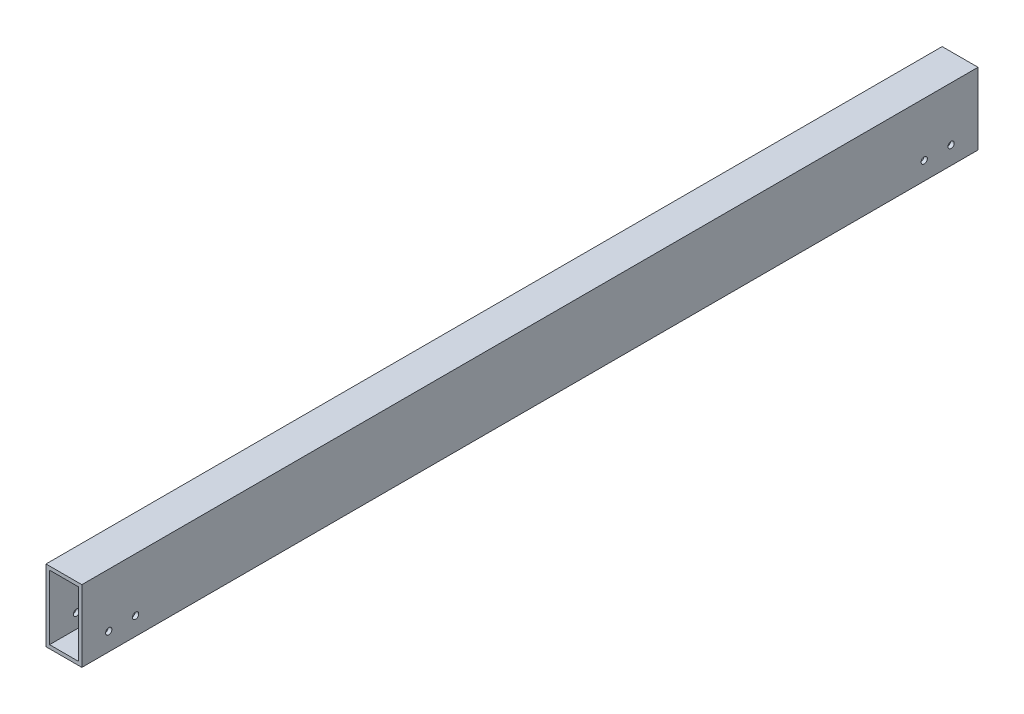
ISO-10303-21;
HEADER;
FILE_DESCRIPTION(('STEP AP214'),'2;1');
FILE_NAME('part.step','',(''),(''),'','','');
FILE_SCHEMA(('AUTOMOTIVE_DESIGN { 1 0 10303 214 1 1 1 1 }'));
ENDSEC;
DATA;
#1=APPLICATION_CONTEXT('core data for automotive mechanical design processes');
#2=APPLICATION_PROTOCOL_DEFINITION('international standard','automotive_design',2000,#1);
#3=PRODUCT_CONTEXT('',#1,'mechanical');
#4=PRODUCT('Part','Part','',(#3));
#5=PRODUCT_RELATED_PRODUCT_CATEGORY('part','',(#4));
#6=PRODUCT_DEFINITION_FORMATION('','',#4);
#7=PRODUCT_DEFINITION_CONTEXT('part definition',#1,'design');
#8=PRODUCT_DEFINITION('design','',#6,#7);
#9=PRODUCT_DEFINITION_SHAPE('','',#8);
#10=(LENGTH_UNIT() NAMED_UNIT(*) SI_UNIT(.MILLI.,.METRE.));
#11=(NAMED_UNIT(*) PLANE_ANGLE_UNIT() SI_UNIT($,.RADIAN.));
#12=(NAMED_UNIT(*) SI_UNIT($,.STERADIAN.) SOLID_ANGLE_UNIT());
#13=UNCERTAINTY_MEASURE_WITH_UNIT(LENGTH_MEASURE(1.E-05),#10,'distance_accuracy_value','');
#14=(GEOMETRIC_REPRESENTATION_CONTEXT(3) GLOBAL_UNCERTAINTY_ASSIGNED_CONTEXT((#13)) GLOBAL_UNIT_ASSIGNED_CONTEXT((#10,
#11,#12)) REPRESENTATION_CONTEXT('',''));
#15=CARTESIAN_POINT('',(0.,0.,0.));
#16=DIRECTION('',(0.,0.,1.));
#17=DIRECTION('',(1.,0.,0.));
#18=AXIS2_PLACEMENT_3D('',#15,#16,#17);
#19=CARTESIAN_POINT('',(0.,0.,500.));
#20=DIRECTION('',(0.,0.,-1.));
#21=DIRECTION('',(-1.,0.,0.));
#22=AXIS2_PLACEMENT_3D('',#19,#20,#21);
#23=PLANE('',#22);
#24=DIRECTION('',(0.,-1.,0.));
#25=VECTOR('',#24,1.);
#26=CARTESIAN_POINT('',(0.,0.,500.));
#27=LINE('',#26,#25);
#28=CARTESIAN_POINT('',(0.,40.,500.));
#29=VERTEX_POINT('',#28);
#30=CARTESIAN_POINT('',(0.,0.,500.));
#31=VERTEX_POINT('',#30);
#32=EDGE_CURVE('E136',#29,#31,#27,.T.);
#33=ORIENTED_EDGE('',*,*,#32,.T.);
#34=DIRECTION('',(1.,0.,0.));
#35=VECTOR('',#34,1.);
#36=CARTESIAN_POINT('',(0.,0.,500.));
#37=LINE('',#36,#35);
#38=CARTESIAN_POINT('',(20.,0.,500.));
#39=VERTEX_POINT('',#38);
#40=EDGE_CURVE('E139',#31,#39,#37,.T.);
#41=ORIENTED_EDGE('',*,*,#40,.T.);
#42=DIRECTION('',(0.,1.,0.));
#43=VECTOR('',#42,1.);
#44=CARTESIAN_POINT('',(20.,0.,500.));
#45=LINE('',#44,#43);
#46=CARTESIAN_POINT('',(20.,40.,500.));
#47=VERTEX_POINT('',#46);
#48=EDGE_CURVE('E142',#39,#47,#45,.T.);
#49=ORIENTED_EDGE('',*,*,#48,.T.);
#50=DIRECTION('',(-1.,0.,0.));
#51=VECTOR('',#50,1.);
#52=CARTESIAN_POINT('',(0.,40.,500.));
#53=LINE('',#52,#51);
#54=EDGE_CURVE('E144',#47,#29,#53,.T.);
#55=ORIENTED_EDGE('',*,*,#54,.T.);
#56=EDGE_LOOP('',(#33,#41,#49,#55));
#57=FACE_BOUND('',#56,.T.);
#58=DIRECTION('',(0.,-1.,0.));
#59=VECTOR('',#58,1.);
#60=CARTESIAN_POINT('',(2.,2.,500.));
#61=LINE('',#60,#59);
#62=CARTESIAN_POINT('',(2.,38.,500.));
#63=VERTEX_POINT('',#62);
#64=CARTESIAN_POINT('',(2.,2.,500.));
#65=VERTEX_POINT('',#64);
#66=EDGE_CURVE('E98',#63,#65,#61,.T.);
#67=ORIENTED_EDGE('',*,*,#66,.F.);
#68=DIRECTION('',(-1.,0.,0.));
#69=VECTOR('',#68,1.);
#70=CARTESIAN_POINT('',(2.,38.,500.));
#71=LINE('',#70,#69);
#72=CARTESIAN_POINT('',(18.,38.,500.));
#73=VERTEX_POINT('',#72);
#74=EDGE_CURVE('E120',#73,#63,#71,.T.);
#75=ORIENTED_EDGE('',*,*,#74,.F.);
#76=DIRECTION('',(0.,1.,0.));
#77=VECTOR('',#76,1.);
#78=CARTESIAN_POINT('',(18.,2.,500.));
#79=LINE('',#78,#77);
#80=CARTESIAN_POINT('',(18.,2.,500.));
#81=VERTEX_POINT('',#80);
#82=EDGE_CURVE('E118',#81,#73,#79,.T.);
#83=ORIENTED_EDGE('',*,*,#82,.F.);
#84=DIRECTION('',(1.,0.,0.));
#85=VECTOR('',#84,1.);
#86=CARTESIAN_POINT('',(2.,2.,500.));
#87=LINE('',#86,#85);
#88=EDGE_CURVE('E106',#65,#81,#87,.T.);
#89=ORIENTED_EDGE('',*,*,#88,.F.);
#90=EDGE_LOOP('',(#67,#75,#83,#89));
#91=FACE_BOUND('',#90,.T.);
#92=ADVANCED_FACE('F33',(#57,#91),#23,.F.);
#93=CARTESIAN_POINT('',(0.,0.,0.));
#94=DIRECTION('',(0.,0.,-1.));
#95=DIRECTION('',(-1.,0.,0.));
#96=AXIS2_PLACEMENT_3D('',#93,#94,#95);
#97=PLANE('',#96);
#98=DIRECTION('',(0.,-1.,0.));
#99=VECTOR('',#98,1.);
#100=CARTESIAN_POINT('',(0.,0.,0.));
#101=LINE('',#100,#99);
#102=CARTESIAN_POINT('',(0.,40.,0.));
#103=VERTEX_POINT('',#102);
#104=CARTESIAN_POINT('',(0.,0.,0.));
#105=VERTEX_POINT('',#104);
#106=EDGE_CURVE('E114',#103,#105,#101,.T.);
#107=ORIENTED_EDGE('',*,*,#106,.F.);
#108=DIRECTION('',(-1.,0.,0.));
#109=VECTOR('',#108,1.);
#110=CARTESIAN_POINT('',(0.,40.,0.));
#111=LINE('',#110,#109);
#112=CARTESIAN_POINT('',(20.,40.,0.));
#113=VERTEX_POINT('',#112);
#114=EDGE_CURVE('E140',#113,#103,#111,.T.);
#115=ORIENTED_EDGE('',*,*,#114,.F.);
#116=DIRECTION('',(0.,1.,0.));
#117=VECTOR('',#116,1.);
#118=CARTESIAN_POINT('',(20.,0.,0.));
#119=LINE('',#118,#117);
#120=CARTESIAN_POINT('',(20.,0.,0.));
#121=VERTEX_POINT('',#120);
#122=EDGE_CURVE('E151',#121,#113,#119,.T.);
#123=ORIENTED_EDGE('',*,*,#122,.F.);
#124=DIRECTION('',(1.,0.,0.));
#125=VECTOR('',#124,1.);
#126=CARTESIAN_POINT('',(0.,0.,0.));
#127=LINE('',#126,#125);
#128=EDGE_CURVE('E149',#105,#121,#127,.T.);
#129=ORIENTED_EDGE('',*,*,#128,.F.);
#130=EDGE_LOOP('',(#107,#115,#123,#129));
#131=FACE_BOUND('',#130,.T.);
#132=DIRECTION('',(-1.,0.,0.));
#133=VECTOR('',#132,1.);
#134=CARTESIAN_POINT('',(2.,38.,0.));
#135=LINE('',#134,#133);
#136=CARTESIAN_POINT('',(18.,38.,0.));
#137=VERTEX_POINT('',#136);
#138=CARTESIAN_POINT('',(2.,38.,0.));
#139=VERTEX_POINT('',#138);
#140=EDGE_CURVE('E107',#137,#139,#135,.T.);
#141=ORIENTED_EDGE('',*,*,#140,.T.);
#142=DIRECTION('',(0.,-1.,0.));
#143=VECTOR('',#142,1.);
#144=CARTESIAN_POINT('',(2.,2.,0.));
#145=LINE('',#144,#143);
#146=CARTESIAN_POINT('',(2.,2.,0.));
#147=VERTEX_POINT('',#146);
#148=EDGE_CURVE('E56',#139,#147,#145,.T.);
#149=ORIENTED_EDGE('',*,*,#148,.T.);
#150=DIRECTION('',(1.,0.,0.));
#151=VECTOR('',#150,1.);
#152=CARTESIAN_POINT('',(2.,2.,0.));
#153=LINE('',#152,#151);
#154=CARTESIAN_POINT('',(18.,2.,0.));
#155=VERTEX_POINT('',#154);
#156=EDGE_CURVE('E113',#147,#155,#153,.T.);
#157=ORIENTED_EDGE('',*,*,#156,.T.);
#158=DIRECTION('',(0.,1.,0.));
#159=VECTOR('',#158,1.);
#160=CARTESIAN_POINT('',(18.,2.,0.));
#161=LINE('',#160,#159);
#162=EDGE_CURVE('E128',#155,#137,#161,.T.);
#163=ORIENTED_EDGE('',*,*,#162,.T.);
#164=EDGE_LOOP('',(#141,#149,#157,#163));
#165=FACE_BOUND('',#164,.T.);
#166=ADVANCED_FACE('F169',(#131,#165),#97,.T.);
#167=CARTESIAN_POINT('',(0.,0.,500.));
#168=DIRECTION('',(1.,0.,0.));
#169=DIRECTION('',(0.,0.,-1.));
#170=AXIS2_PLACEMENT_3D('',#167,#168,#169);
#171=PLANE('',#170);
#172=CARTESIAN_POINT('',(0.,9.99999999999991,15.));
#173=DIRECTION('',(-1.,0.,0.));
#174=DIRECTION('',(0.,0.,1.));
#175=AXIS2_PLACEMENT_3D('',#172,#173,#174);
#176=CIRCLE('',#175,1.75);
#177=CARTESIAN_POINT('',(0.,9.99999999999991,16.75));
#178=VERTEX_POINT('',#177);
#179=EDGE_CURVE('E221',#178,#178,#176,.T.);
#180=ORIENTED_EDGE('',*,*,#179,.F.);
#181=EDGE_LOOP('',(#180));
#182=FACE_BOUND('',#181,.T.);
#183=CARTESIAN_POINT('',(0.,9.99999999999988,470.));
#184=DIRECTION('',(-1.,0.,0.));
#185=DIRECTION('',(0.,0.,-1.));
#186=AXIS2_PLACEMENT_3D('',#183,#184,#185);
#187=CIRCLE('',#186,1.74999999999998);
#188=CARTESIAN_POINT('',(0.,9.99999999999988,468.25));
#189=VERTEX_POINT('',#188);
#190=EDGE_CURVE('E229',#189,#189,#187,.T.);
#191=ORIENTED_EDGE('',*,*,#190,.F.);
#192=EDGE_LOOP('',(#191));
#193=FACE_BOUND('',#192,.T.);
#194=CARTESIAN_POINT('',(0.,9.99999999999997,485.));
#195=DIRECTION('',(-1.,0.,0.));
#196=DIRECTION('',(0.,0.,-1.));
#197=AXIS2_PLACEMENT_3D('',#194,#195,#196);
#198=CIRCLE('',#197,1.74999999999998);
#199=CARTESIAN_POINT('',(0.,9.99999999999997,483.25));
#200=VERTEX_POINT('',#199);
#201=EDGE_CURVE('E232',#200,#200,#198,.T.);
#202=ORIENTED_EDGE('',*,*,#201,.F.);
#203=EDGE_LOOP('',(#202));
#204=FACE_BOUND('',#203,.T.);
#205=CARTESIAN_POINT('',(0.,9.99999999999982,30.));
#206=DIRECTION('',(-1.,0.,0.));
#207=DIRECTION('',(0.,0.,1.));
#208=AXIS2_PLACEMENT_3D('',#205,#206,#207);
#209=CIRCLE('',#208,1.75);
#210=CARTESIAN_POINT('',(0.,9.99999999999982,31.75));
#211=VERTEX_POINT('',#210);
#212=EDGE_CURVE('E222',#211,#211,#209,.T.);
#213=ORIENTED_EDGE('',*,*,#212,.F.);
#214=EDGE_LOOP('',(#213));
#215=FACE_BOUND('',#214,.T.);
#216=ORIENTED_EDGE('',*,*,#106,.T.);
#217=DIRECTION('',(0.,0.,-1.));
#218=VECTOR('',#217,1.);
#219=CARTESIAN_POINT('',(0.,0.,500.));
#220=LINE('',#219,#218);
#221=EDGE_CURVE('E11',#31,#105,#220,.T.);
#222=ORIENTED_EDGE('',*,*,#221,.F.);
#223=ORIENTED_EDGE('',*,*,#32,.F.);
#224=DIRECTION('',(0.,0.,-1.));
#225=VECTOR('',#224,1.);
#226=CARTESIAN_POINT('',(0.,40.,500.));
#227=LINE('',#226,#225);
#228=EDGE_CURVE('E146',#29,#103,#227,.T.);
#229=ORIENTED_EDGE('',*,*,#228,.T.);
#230=EDGE_LOOP('',(#216,#222,#223,#229));
#231=FACE_BOUND('',#230,.T.);
#232=ADVANCED_FACE('F35',(#182,#193,#204,#215,#231),#171,.F.);
#233=CARTESIAN_POINT('',(0.,0.,500.));
#234=DIRECTION('',(0.,1.,0.));
#235=DIRECTION('',(0.,0.,1.));
#236=AXIS2_PLACEMENT_3D('',#233,#234,#235);
#237=PLANE('',#236);
#238=ORIENTED_EDGE('',*,*,#128,.T.);
#239=DIRECTION('',(0.,0.,-1.));
#240=VECTOR('',#239,1.);
#241=CARTESIAN_POINT('',(20.,0.,500.));
#242=LINE('',#241,#240);
#243=EDGE_CURVE('E41',#39,#121,#242,.T.);
#244=ORIENTED_EDGE('',*,*,#243,.F.);
#245=ORIENTED_EDGE('',*,*,#40,.F.);
#246=ORIENTED_EDGE('',*,*,#221,.T.);
#247=EDGE_LOOP('',(#238,#244,#245,#246));
#248=FACE_BOUND('',#247,.T.);
#249=ADVANCED_FACE('F179',(#248),#237,.F.);
#250=CARTESIAN_POINT('',(20.,0.,500.));
#251=DIRECTION('',(-1.,0.,0.));
#252=DIRECTION('',(0.,0.,1.));
#253=AXIS2_PLACEMENT_3D('',#250,#251,#252);
#254=PLANE('',#253);
#255=CARTESIAN_POINT('',(20.,9.99999999999997,485.));
#256=DIRECTION('',(1.,0.,0.));
#257=DIRECTION('',(0.,0.,-1.));
#258=AXIS2_PLACEMENT_3D('',#255,#256,#257);
#259=CIRCLE('',#258,1.74999999999998);
#260=CARTESIAN_POINT('',(20.,9.99999999999997,483.25));
#261=VERTEX_POINT('',#260);
#262=EDGE_CURVE('E253',#261,#261,#259,.T.);
#263=ORIENTED_EDGE('',*,*,#262,.F.);
#264=EDGE_LOOP('',(#263));
#265=FACE_BOUND('',#264,.T.);
#266=CARTESIAN_POINT('',(20.,10.,30.));
#267=DIRECTION('',(1.,0.,0.));
#268=DIRECTION('',(0.,0.,1.));
#269=AXIS2_PLACEMENT_3D('',#266,#267,#268);
#270=CIRCLE('',#269,1.74999999999998);
#271=CARTESIAN_POINT('',(20.,10.,31.75));
#272=VERTEX_POINT('',#271);
#273=EDGE_CURVE('E254',#272,#272,#270,.T.);
#274=ORIENTED_EDGE('',*,*,#273,.F.);
#275=EDGE_LOOP('',(#274));
#276=FACE_BOUND('',#275,.T.);
#277=CARTESIAN_POINT('',(20.,10.,15.));
#278=DIRECTION('',(1.,0.,0.));
#279=DIRECTION('',(0.,0.,1.));
#280=AXIS2_PLACEMENT_3D('',#277,#278,#279);
#281=CIRCLE('',#280,1.74999999999998);
#282=CARTESIAN_POINT('',(20.,10.,16.75));
#283=VERTEX_POINT('',#282);
#284=EDGE_CURVE('E240',#283,#283,#281,.T.);
#285=ORIENTED_EDGE('',*,*,#284,.F.);
#286=EDGE_LOOP('',(#285));
#287=FACE_BOUND('',#286,.T.);
#288=CARTESIAN_POINT('',(20.,9.99999999999997,470.));
#289=DIRECTION('',(1.,0.,0.));
#290=DIRECTION('',(0.,0.,-1.));
#291=AXIS2_PLACEMENT_3D('',#288,#289,#290);
#292=CIRCLE('',#291,1.74999999999998);
#293=CARTESIAN_POINT('',(20.,9.99999999999997,468.25));
#294=VERTEX_POINT('',#293);
#295=EDGE_CURVE('E247',#294,#294,#292,.T.);
#296=ORIENTED_EDGE('',*,*,#295,.F.);
#297=EDGE_LOOP('',(#296));
#298=FACE_BOUND('',#297,.T.);
#299=ORIENTED_EDGE('',*,*,#122,.T.);
#300=DIRECTION('',(0.,0.,-1.));
#301=VECTOR('',#300,1.);
#302=CARTESIAN_POINT('',(20.,40.,500.));
#303=LINE('',#302,#301);
#304=EDGE_CURVE('E156',#47,#113,#303,.T.);
#305=ORIENTED_EDGE('',*,*,#304,.F.);
#306=ORIENTED_EDGE('',*,*,#48,.F.);
#307=ORIENTED_EDGE('',*,*,#243,.T.);
#308=EDGE_LOOP('',(#299,#305,#306,#307));
#309=FACE_BOUND('',#308,.T.);
#310=ADVANCED_FACE('F163',(#265,#276,#287,#298,#309),#254,.F.);
#311=CARTESIAN_POINT('',(0.,40.,500.));
#312=DIRECTION('',(0.,-1.,0.));
#313=DIRECTION('',(0.,0.,-1.));
#314=AXIS2_PLACEMENT_3D('',#311,#312,#313);
#315=PLANE('',#314);
#316=ORIENTED_EDGE('',*,*,#114,.T.);
#317=ORIENTED_EDGE('',*,*,#228,.F.);
#318=ORIENTED_EDGE('',*,*,#54,.F.);
#319=ORIENTED_EDGE('',*,*,#304,.T.);
#320=EDGE_LOOP('',(#316,#317,#318,#319));
#321=FACE_BOUND('',#320,.T.);
#322=ADVANCED_FACE('F173',(#321),#315,.F.);
#323=CARTESIAN_POINT('',(2.,2.,500.));
#324=DIRECTION('',(1.,0.,0.));
#325=DIRECTION('',(0.,0.,-1.));
#326=AXIS2_PLACEMENT_3D('',#323,#324,#325);
#327=PLANE('',#326);
#328=CARTESIAN_POINT('',(2.,9.99999999999991,15.));
#329=DIRECTION('',(-1.,0.,0.));
#330=DIRECTION('',(0.,0.,1.));
#331=AXIS2_PLACEMENT_3D('',#328,#329,#330);
#332=CIRCLE('',#331,1.75);
#333=CARTESIAN_POINT('',(2.,9.99999999999991,16.75));
#334=VERTEX_POINT('',#333);
#335=EDGE_CURVE('E126',#334,#334,#332,.T.);
#336=ORIENTED_EDGE('',*,*,#335,.T.);
#337=EDGE_LOOP('',(#336));
#338=FACE_BOUND('',#337,.T.);
#339=CARTESIAN_POINT('',(2.,9.99999999999988,470.));
#340=DIRECTION('',(-1.,0.,0.));
#341=DIRECTION('',(0.,0.,-1.));
#342=AXIS2_PLACEMENT_3D('',#339,#340,#341);
#343=CIRCLE('',#342,1.74999999999998);
#344=CARTESIAN_POINT('',(2.,9.99999999999988,468.25));
#345=VERTEX_POINT('',#344);
#346=EDGE_CURVE('E212',#345,#345,#343,.T.);
#347=ORIENTED_EDGE('',*,*,#346,.T.);
#348=EDGE_LOOP('',(#347));
#349=FACE_BOUND('',#348,.T.);
#350=CARTESIAN_POINT('',(2.,9.99999999999997,485.));
#351=DIRECTION('',(-1.,0.,0.));
#352=DIRECTION('',(0.,0.,-1.));
#353=AXIS2_PLACEMENT_3D('',#350,#351,#352);
#354=CIRCLE('',#353,1.74999999999998);
#355=CARTESIAN_POINT('',(2.,9.99999999999997,483.25));
#356=VERTEX_POINT('',#355);
#357=EDGE_CURVE('E216',#356,#356,#354,.T.);
#358=ORIENTED_EDGE('',*,*,#357,.T.);
#359=EDGE_LOOP('',(#358));
#360=FACE_BOUND('',#359,.T.);
#361=CARTESIAN_POINT('',(2.,9.99999999999982,30.));
#362=DIRECTION('',(-1.,0.,0.));
#363=DIRECTION('',(0.,0.,1.));
#364=AXIS2_PLACEMENT_3D('',#361,#362,#363);
#365=CIRCLE('',#364,1.75);
#366=CARTESIAN_POINT('',(2.,9.99999999999982,31.75));
#367=VERTEX_POINT('',#366);
#368=EDGE_CURVE('E219',#367,#367,#365,.T.);
#369=ORIENTED_EDGE('',*,*,#368,.T.);
#370=EDGE_LOOP('',(#369));
#371=FACE_BOUND('',#370,.T.);
#372=ORIENTED_EDGE('',*,*,#148,.F.);
#373=DIRECTION('',(0.,0.,-1.));
#374=VECTOR('',#373,1.);
#375=CARTESIAN_POINT('',(2.,38.,500.));
#376=LINE('',#375,#374);
#377=EDGE_CURVE('E102',#63,#139,#376,.T.);
#378=ORIENTED_EDGE('',*,*,#377,.F.);
#379=ORIENTED_EDGE('',*,*,#66,.T.);
#380=DIRECTION('',(0.,0.,-1.));
#381=VECTOR('',#380,1.);
#382=CARTESIAN_POINT('',(2.,2.,500.));
#383=LINE('',#382,#381);
#384=EDGE_CURVE('E101',#65,#147,#383,.T.);
#385=ORIENTED_EDGE('',*,*,#384,.T.);
#386=EDGE_LOOP('',(#372,#378,#379,#385));
#387=FACE_BOUND('',#386,.T.);
#388=ADVANCED_FACE('F100',(#338,#349,#360,#371,#387),#327,.T.);
#389=CARTESIAN_POINT('',(2.,2.,500.));
#390=DIRECTION('',(0.,1.,0.));
#391=DIRECTION('',(0.,0.,1.));
#392=AXIS2_PLACEMENT_3D('',#389,#390,#391);
#393=PLANE('',#392);
#394=ORIENTED_EDGE('',*,*,#156,.F.);
#395=ORIENTED_EDGE('',*,*,#384,.F.);
#396=ORIENTED_EDGE('',*,*,#88,.T.);
#397=DIRECTION('',(0.,0.,-1.));
#398=VECTOR('',#397,1.);
#399=CARTESIAN_POINT('',(18.,2.,500.));
#400=LINE('',#399,#398);
#401=EDGE_CURVE('E115',#81,#155,#400,.T.);
#402=ORIENTED_EDGE('',*,*,#401,.T.);
#403=EDGE_LOOP('',(#394,#395,#396,#402));
#404=FACE_BOUND('',#403,.T.);
#405=ADVANCED_FACE('F110',(#404),#393,.T.);
#406=CARTESIAN_POINT('',(18.,2.,500.));
#407=DIRECTION('',(-1.,0.,0.));
#408=DIRECTION('',(0.,0.,1.));
#409=AXIS2_PLACEMENT_3D('',#406,#407,#408);
#410=PLANE('',#409);
#411=CARTESIAN_POINT('',(18.,9.99999999999997,485.));
#412=DIRECTION('',(1.,0.,0.));
#413=DIRECTION('',(0.,0.,-1.));
#414=AXIS2_PLACEMENT_3D('',#411,#412,#413);
#415=CIRCLE('',#414,1.74999999999998);
#416=CARTESIAN_POINT('',(18.,9.99999999999997,483.25));
#417=VERTEX_POINT('',#416);
#418=EDGE_CURVE('E237',#417,#417,#415,.T.);
#419=ORIENTED_EDGE('',*,*,#418,.T.);
#420=EDGE_LOOP('',(#419));
#421=FACE_BOUND('',#420,.T.);
#422=CARTESIAN_POINT('',(18.,10.,30.));
#423=DIRECTION('',(1.,0.,0.));
#424=DIRECTION('',(0.,0.,1.));
#425=AXIS2_PLACEMENT_3D('',#422,#423,#424);
#426=CIRCLE('',#425,1.74999999999998);
#427=CARTESIAN_POINT('',(18.,10.,31.75));
#428=VERTEX_POINT('',#427);
#429=EDGE_CURVE('E244',#428,#428,#426,.T.);
#430=ORIENTED_EDGE('',*,*,#429,.T.);
#431=EDGE_LOOP('',(#430));
#432=FACE_BOUND('',#431,.T.);
#433=CARTESIAN_POINT('',(18.,10.,15.));
#434=DIRECTION('',(1.,0.,0.));
#435=DIRECTION('',(0.,0.,1.));
#436=AXIS2_PLACEMENT_3D('',#433,#434,#435);
#437=CIRCLE('',#436,1.74999999999998);
#438=CARTESIAN_POINT('',(18.,10.,16.75));
#439=VERTEX_POINT('',#438);
#440=EDGE_CURVE('E243',#439,#439,#437,.T.);
#441=ORIENTED_EDGE('',*,*,#440,.T.);
#442=EDGE_LOOP('',(#441));
#443=FACE_BOUND('',#442,.T.);
#444=CARTESIAN_POINT('',(18.,9.99999999999997,470.));
#445=DIRECTION('',(1.,0.,0.));
#446=DIRECTION('',(0.,0.,-1.));
#447=AXIS2_PLACEMENT_3D('',#444,#445,#446);
#448=CIRCLE('',#447,1.74999999999998);
#449=CARTESIAN_POINT('',(18.,9.99999999999997,468.25));
#450=VERTEX_POINT('',#449);
#451=EDGE_CURVE('E250',#450,#450,#448,.T.);
#452=ORIENTED_EDGE('',*,*,#451,.T.);
#453=EDGE_LOOP('',(#452));
#454=FACE_BOUND('',#453,.T.);
#455=ORIENTED_EDGE('',*,*,#162,.F.);
#456=ORIENTED_EDGE('',*,*,#401,.F.);
#457=ORIENTED_EDGE('',*,*,#82,.T.);
#458=DIRECTION('',(0.,0.,-1.));
#459=VECTOR('',#458,1.);
#460=CARTESIAN_POINT('',(18.,38.,500.));
#461=LINE('',#460,#459);
#462=EDGE_CURVE('E48',#73,#137,#461,.T.);
#463=ORIENTED_EDGE('',*,*,#462,.T.);
#464=EDGE_LOOP('',(#455,#456,#457,#463));
#465=FACE_BOUND('',#464,.T.);
#466=ADVANCED_FACE('F205',(#421,#432,#443,#454,#465),#410,.T.);
#467=CARTESIAN_POINT('',(2.,38.,500.));
#468=DIRECTION('',(0.,-1.,0.));
#469=DIRECTION('',(0.,0.,-1.));
#470=AXIS2_PLACEMENT_3D('',#467,#468,#469);
#471=PLANE('',#470);
#472=ORIENTED_EDGE('',*,*,#140,.F.);
#473=ORIENTED_EDGE('',*,*,#462,.F.);
#474=ORIENTED_EDGE('',*,*,#74,.T.);
#475=ORIENTED_EDGE('',*,*,#377,.T.);
#476=EDGE_LOOP('',(#472,#473,#474,#475));
#477=FACE_BOUND('',#476,.T.);
#478=ADVANCED_FACE('F304',(#477),#471,.T.);
#479=CARTESIAN_POINT('',(2.,9.99999999999982,30.));
#480=DIRECTION('',(-1.,0.,0.));
#481=DIRECTION('',(0.,0.,1.));
#482=AXIS2_PLACEMENT_3D('',#479,#480,#481);
#483=CYLINDRICAL_SURFACE('',#482,1.75);
#484=ORIENTED_EDGE('',*,*,#368,.F.);
#485=EDGE_LOOP('',(#484));
#486=FACE_BOUND('',#485,.T.);
#487=ORIENTED_EDGE('',*,*,#212,.T.);
#488=EDGE_LOOP('',(#487));
#489=FACE_BOUND('',#488,.T.);
#490=ADVANCED_FACE('F301',(#486,#489),#483,.F.);
#491=CARTESIAN_POINT('',(2.,9.99999999999997,485.));
#492=DIRECTION('',(-1.,0.,0.));
#493=DIRECTION('',(0.,0.,1.));
#494=AXIS2_PLACEMENT_3D('',#491,#492,#493);
#495=CYLINDRICAL_SURFACE('',#494,1.74999999999998);
#496=ORIENTED_EDGE('',*,*,#357,.F.);
#497=EDGE_LOOP('',(#496));
#498=FACE_BOUND('',#497,.T.);
#499=ORIENTED_EDGE('',*,*,#201,.T.);
#500=EDGE_LOOP('',(#499));
#501=FACE_BOUND('',#500,.T.);
#502=ADVANCED_FACE('F299',(#498,#501),#495,.F.);
#503=CARTESIAN_POINT('',(2.,9.99999999999988,470.));
#504=DIRECTION('',(-1.,0.,0.));
#505=DIRECTION('',(0.,0.,1.));
#506=AXIS2_PLACEMENT_3D('',#503,#504,#505);
#507=CYLINDRICAL_SURFACE('',#506,1.74999999999998);
#508=ORIENTED_EDGE('',*,*,#346,.F.);
#509=EDGE_LOOP('',(#508));
#510=FACE_BOUND('',#509,.T.);
#511=ORIENTED_EDGE('',*,*,#190,.T.);
#512=EDGE_LOOP('',(#511));
#513=FACE_BOUND('',#512,.T.);
#514=ADVANCED_FACE('F291',(#510,#513),#507,.F.);
#515=CARTESIAN_POINT('',(2.,9.99999999999991,15.));
#516=DIRECTION('',(-1.,0.,0.));
#517=DIRECTION('',(0.,0.,1.));
#518=AXIS2_PLACEMENT_3D('',#515,#516,#517);
#519=CYLINDRICAL_SURFACE('',#518,1.75);
#520=ORIENTED_EDGE('',*,*,#335,.F.);
#521=EDGE_LOOP('',(#520));
#522=FACE_BOUND('',#521,.T.);
#523=ORIENTED_EDGE('',*,*,#179,.T.);
#524=EDGE_LOOP('',(#523));
#525=FACE_BOUND('',#524,.T.);
#526=ADVANCED_FACE('F282',(#522,#525),#519,.F.);
#527=CARTESIAN_POINT('',(18.,9.99999999999997,470.));
#528=DIRECTION('',(1.,0.,0.));
#529=DIRECTION('',(0.,0.,-1.));
#530=AXIS2_PLACEMENT_3D('',#527,#528,#529);
#531=CYLINDRICAL_SURFACE('',#530,1.74999999999998);
#532=ORIENTED_EDGE('',*,*,#451,.F.);
#533=EDGE_LOOP('',(#532));
#534=FACE_BOUND('',#533,.T.);
#535=ORIENTED_EDGE('',*,*,#295,.T.);
#536=EDGE_LOOP('',(#535));
#537=FACE_BOUND('',#536,.T.);
#538=ADVANCED_FACE('F279',(#534,#537),#531,.F.);
#539=CARTESIAN_POINT('',(18.,10.,15.));
#540=DIRECTION('',(1.,0.,0.));
#541=DIRECTION('',(0.,0.,-1.));
#542=AXIS2_PLACEMENT_3D('',#539,#540,#541);
#543=CYLINDRICAL_SURFACE('',#542,1.74999999999998);
#544=ORIENTED_EDGE('',*,*,#440,.F.);
#545=EDGE_LOOP('',(#544));
#546=FACE_BOUND('',#545,.T.);
#547=ORIENTED_EDGE('',*,*,#284,.T.);
#548=EDGE_LOOP('',(#547));
#549=FACE_BOUND('',#548,.T.);
#550=ADVANCED_FACE('F281',(#546,#549),#543,.F.);
#551=CARTESIAN_POINT('',(18.,10.,30.));
#552=DIRECTION('',(1.,0.,0.));
#553=DIRECTION('',(0.,0.,-1.));
#554=AXIS2_PLACEMENT_3D('',#551,#552,#553);
#555=CYLINDRICAL_SURFACE('',#554,1.74999999999998);
#556=ORIENTED_EDGE('',*,*,#429,.F.);
#557=EDGE_LOOP('',(#556));
#558=FACE_BOUND('',#557,.T.);
#559=ORIENTED_EDGE('',*,*,#273,.T.);
#560=EDGE_LOOP('',(#559));
#561=FACE_BOUND('',#560,.T.);
#562=ADVANCED_FACE('F269',(#558,#561),#555,.F.);
#563=CARTESIAN_POINT('',(18.,9.99999999999997,485.));
#564=DIRECTION('',(1.,0.,0.));
#565=DIRECTION('',(0.,0.,-1.));
#566=AXIS2_PLACEMENT_3D('',#563,#564,#565);
#567=CYLINDRICAL_SURFACE('',#566,1.74999999999998);
#568=ORIENTED_EDGE('',*,*,#418,.F.);
#569=EDGE_LOOP('',(#568));
#570=FACE_BOUND('',#569,.T.);
#571=ORIENTED_EDGE('',*,*,#262,.T.);
#572=EDGE_LOOP('',(#571));
#573=FACE_BOUND('',#572,.T.);
#574=ADVANCED_FACE('F266',(#570,#573),#567,.F.);
#575=CLOSED_SHELL('',(#92,#166,#232,#249,#310,#322,#388,#405,#466,#478,#490,#502,#514,#526,#538,
#550,#562,#574));
#576=MANIFOLD_SOLID_BREP('B2',#575);
#577=ADVANCED_BREP_SHAPE_REPRESENTATION('',(#18,#576),#14);
#578=SHAPE_DEFINITION_REPRESENTATION(#9,#577);
ENDSEC;
END-ISO-10303-21;
